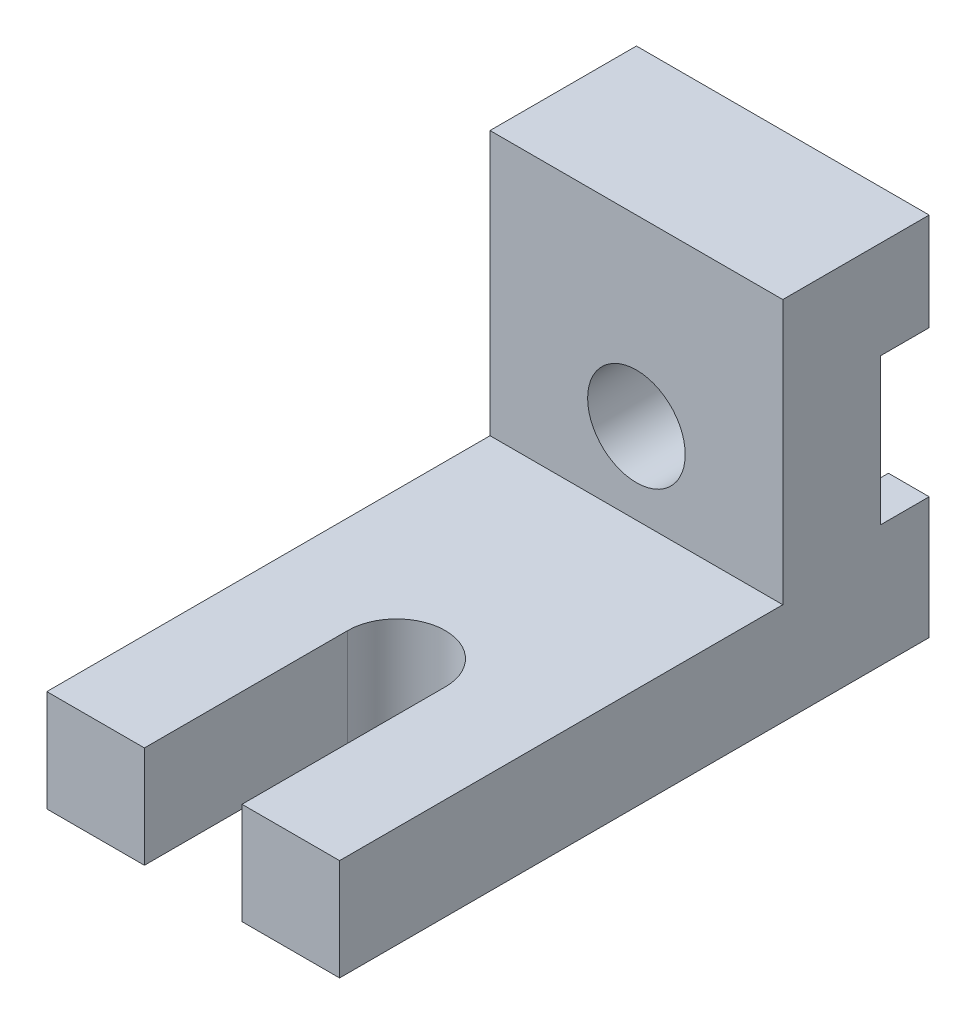
ISO-10303-21;
HEADER;
FILE_DESCRIPTION(('STEP AP214'),'2;1');
FILE_NAME('part.step','',(''),(''),'','','');
FILE_SCHEMA(('AUTOMOTIVE_DESIGN { 1 0 10303 214 1 1 1 1 }'));
ENDSEC;
DATA;
#1=APPLICATION_CONTEXT('core data for automotive mechanical design processes');
#2=APPLICATION_PROTOCOL_DEFINITION('international standard','automotive_design',2000,#1);
#3=PRODUCT_CONTEXT('',#1,'mechanical');
#4=PRODUCT('Part','Part','',(#3));
#5=PRODUCT_RELATED_PRODUCT_CATEGORY('part','',(#4));
#6=PRODUCT_DEFINITION_FORMATION('','',#4);
#7=PRODUCT_DEFINITION_CONTEXT('part definition',#1,'design');
#8=PRODUCT_DEFINITION('design','',#6,#7);
#9=PRODUCT_DEFINITION_SHAPE('','',#8);
#10=(LENGTH_UNIT() NAMED_UNIT(*) SI_UNIT(.MILLI.,.METRE.));
#11=(NAMED_UNIT(*) PLANE_ANGLE_UNIT() SI_UNIT($,.RADIAN.));
#12=(NAMED_UNIT(*) SI_UNIT($,.STERADIAN.) SOLID_ANGLE_UNIT());
#13=UNCERTAINTY_MEASURE_WITH_UNIT(LENGTH_MEASURE(1.E-05),#10,'distance_accuracy_value','');
#14=(GEOMETRIC_REPRESENTATION_CONTEXT(3) GLOBAL_UNCERTAINTY_ASSIGNED_CONTEXT((#13)) GLOBAL_UNIT_ASSIGNED_CONTEXT((#10,
#11,#12)) REPRESENTATION_CONTEXT('',''));
#15=CARTESIAN_POINT('',(0.,0.,0.));
#16=DIRECTION('',(0.,0.,1.));
#17=DIRECTION('',(1.,0.,0.));
#18=AXIS2_PLACEMENT_3D('',#15,#16,#17);
#19=CARTESIAN_POINT('',(0.,0.,0.));
#20=DIRECTION('',(0.,0.,1.));
#21=DIRECTION('',(1.,0.,0.));
#22=AXIS2_PLACEMENT_3D('',#19,#20,#21);
#23=PLANE('',#22);
#24=DIRECTION('',(0.,1.,0.));
#25=VECTOR('',#24,1.);
#26=CARTESIAN_POINT('',(914.399999999999,-1143.,0.));
#27=LINE('',#26,#25);
#28=CARTESIAN_POINT('',(914.399999999999,533.400000000001,0.));
#29=VERTEX_POINT('',#28);
#30=CARTESIAN_POINT('',(914.399999999999,1143.,0.));
#31=VERTEX_POINT('',#30);
#32=EDGE_CURVE('E337',#29,#31,#27,.T.);
#33=ORIENTED_EDGE('',*,*,#32,.F.);
#34=DIRECTION('',(1.,0.,0.));
#35=VECTOR('',#34,1.);
#36=CARTESIAN_POINT('',(914.399999999999,533.400000000001,0.));
#37=LINE('',#36,#35);
#38=CARTESIAN_POINT('',(544.176846254964,533.400000000001,0.));
#39=VERTEX_POINT('',#38);
#40=EDGE_CURVE('E204',#39,#29,#37,.T.);
#41=ORIENTED_EDGE('',*,*,#40,.F.);
#42=CARTESIAN_POINT('',(0.,0.,0.));
#43=DIRECTION('',(0.,0.,-1.));
#44=DIRECTION('',(-1.,0.,0.));
#45=AXIS2_PLACEMENT_3D('',#42,#43,#44);
#46=CIRCLE('',#45,762.);
#47=CARTESIAN_POINT('',(-544.176846254964,533.400000000001,0.));
#48=VERTEX_POINT('',#47);
#49=EDGE_CURVE('E381',#48,#39,#46,.T.);
#50=ORIENTED_EDGE('',*,*,#49,.F.);
#51=DIRECTION('',(1.,0.,0.));
#52=VECTOR('',#51,1.);
#53=CARTESIAN_POINT('',(-544.176846254964,533.400000000001,0.));
#54=LINE('',#53,#52);
#55=CARTESIAN_POINT('',(-914.400000000001,533.400000000001,0.));
#56=VERTEX_POINT('',#55);
#57=EDGE_CURVE('E377',#56,#48,#54,.T.);
#58=ORIENTED_EDGE('',*,*,#57,.F.);
#59=DIRECTION('',(0.,-1.,0.));
#60=VECTOR('',#59,1.);
#61=CARTESIAN_POINT('',(-914.400000000001,-1143.,0.));
#62=LINE('',#61,#60);
#63=CARTESIAN_POINT('',(-914.400000000001,1143.,0.));
#64=VERTEX_POINT('',#63);
#65=EDGE_CURVE('E330',#64,#56,#62,.T.);
#66=ORIENTED_EDGE('',*,*,#65,.F.);
#67=DIRECTION('',(-1.,0.,0.));
#68=VECTOR('',#67,1.);
#69=CARTESIAN_POINT('',(914.399999999999,1143.,0.));
#70=LINE('',#69,#68);
#71=EDGE_CURVE('E323',#31,#64,#70,.T.);
#72=ORIENTED_EDGE('',*,*,#71,.F.);
#73=EDGE_LOOP('',(#33,#41,#50,#58,#66,#72));
#74=FACE_BOUND('',#73,.T.);
#75=ADVANCED_FACE('F39',(#74),#23,.F.);
#76=CARTESIAN_POINT('',(0.,0.,3683.));
#77=DIRECTION('',(0.,0.,-1.));
#78=DIRECTION('',(-1.,0.,0.));
#79=AXIS2_PLACEMENT_3D('',#76,#77,#78);
#80=PLANE('',#79);
#81=DIRECTION('',(1.,0.,0.));
#82=VECTOR('',#81,1.);
#83=CARTESIAN_POINT('',(-914.400000000001,-1143.,3683.));
#84=LINE('',#83,#82);
#85=CARTESIAN_POINT('',(-914.400000000001,-1143.,3683.));
#86=VERTEX_POINT('',#85);
#87=CARTESIAN_POINT('',(-304.800000000001,-1143.,3683.));
#88=VERTEX_POINT('',#87);
#89=EDGE_CURVE('E296',#86,#88,#84,.T.);
#90=ORIENTED_EDGE('',*,*,#89,.T.);
#91=DIRECTION('',(0.,1.,0.));
#92=VECTOR('',#91,1.);
#93=CARTESIAN_POINT('',(-304.800000000001,-1143.,3683.));
#94=LINE('',#93,#92);
#95=CARTESIAN_POINT('',(-304.800000000001,-508.,3683.));
#96=VERTEX_POINT('',#95);
#97=EDGE_CURVE('E278',#88,#96,#94,.T.);
#98=ORIENTED_EDGE('',*,*,#97,.T.);
#99=DIRECTION('',(-1.,0.,0.));
#100=VECTOR('',#99,1.);
#101=CARTESIAN_POINT('',(-914.400000000001,-508.,3683.));
#102=LINE('',#101,#100);
#103=CARTESIAN_POINT('',(-914.400000000001,-508.,3683.));
#104=VERTEX_POINT('',#103);
#105=EDGE_CURVE('E303',#96,#104,#102,.T.);
#106=ORIENTED_EDGE('',*,*,#105,.T.);
#107=DIRECTION('',(0.,-1.,0.));
#108=VECTOR('',#107,1.);
#109=CARTESIAN_POINT('',(-914.400000000001,-1143.,3683.));
#110=LINE('',#109,#108);
#111=EDGE_CURVE('E291',#104,#86,#110,.T.);
#112=ORIENTED_EDGE('',*,*,#111,.T.);
#113=EDGE_LOOP('',(#90,#98,#106,#112));
#114=FACE_BOUND('',#113,.T.);
#115=ADVANCED_FACE('F429',(#114),#80,.F.);
#116=CARTESIAN_POINT('',(-914.400000000001,-1143.,914.4));
#117=DIRECTION('',(1.,0.,0.));
#118=DIRECTION('',(0.,0.,-1.));
#119=AXIS2_PLACEMENT_3D('',#116,#117,#118);
#120=PLANE('',#119);
#121=ORIENTED_EDGE('',*,*,#65,.T.);
#122=DIRECTION('',(0.,0.,-1.));
#123=VECTOR('',#122,1.);
#124=CARTESIAN_POINT('',(-914.400000000001,533.400000000001,304.8));
#125=LINE('',#124,#123);
#126=CARTESIAN_POINT('',(-914.400000000001,533.400000000001,304.8));
#127=VERTEX_POINT('',#126);
#128=EDGE_CURVE('E395',#127,#56,#125,.T.);
#129=ORIENTED_EDGE('',*,*,#128,.F.);
#130=DIRECTION('',(0.,1.,0.));
#131=VECTOR('',#130,1.);
#132=CARTESIAN_POINT('',(-914.400000000001,533.400000000001,304.8));
#133=LINE('',#132,#131);
#134=CARTESIAN_POINT('',(-914.400000000001,-380.999999999999,304.8));
#135=VERTEX_POINT('',#134);
#136=EDGE_CURVE('E618',#135,#127,#133,.T.);
#137=ORIENTED_EDGE('',*,*,#136,.F.);
#138=DIRECTION('',(0.,0.,-1.));
#139=VECTOR('',#138,1.);
#140=CARTESIAN_POINT('',(-914.400000000001,-380.999999999999,304.8));
#141=LINE('',#140,#139);
#142=CARTESIAN_POINT('',(-914.400000000001,-380.999999999999,0.));
#143=VERTEX_POINT('',#142);
#144=EDGE_CURVE('E398',#135,#143,#141,.T.);
#145=ORIENTED_EDGE('',*,*,#144,.T.);
#146=CARTESIAN_POINT('',(-914.400000000001,-990.599999999999,0.));
#147=VERTEX_POINT('',#146);
#148=EDGE_CURVE('E63',#143,#147,#62,.T.);
#149=ORIENTED_EDGE('',*,*,#148,.T.);
#150=DIRECTION('',(0.,0.,-1.));
#151=VECTOR('',#150,1.);
#152=CARTESIAN_POINT('',(-914.400000000001,-990.6,0.));
#153=LINE('',#152,#151);
#154=CARTESIAN_POINT('',(-914.400000000001,-990.6,1828.8));
#155=VERTEX_POINT('',#154);
#156=EDGE_CURVE('E221',#155,#147,#153,.T.);
#157=ORIENTED_EDGE('',*,*,#156,.F.);
#158=DIRECTION('',(0.,-1.,0.));
#159=VECTOR('',#158,1.);
#160=CARTESIAN_POINT('',(-914.400000000001,-990.6,1828.8));
#161=LINE('',#160,#159);
#162=CARTESIAN_POINT('',(-914.400000000001,-1143.,1828.8));
#163=VERTEX_POINT('',#162);
#164=EDGE_CURVE('E245',#155,#163,#161,.T.);
#165=ORIENTED_EDGE('',*,*,#164,.T.);
#166=DIRECTION('',(0.,0.,-1.));
#167=VECTOR('',#166,1.);
#168=CARTESIAN_POINT('',(-914.400000000001,-1143.,914.4));
#169=LINE('',#168,#167);
#170=EDGE_CURVE('E11',#86,#163,#169,.T.);
#171=ORIENTED_EDGE('',*,*,#170,.F.);
#172=ORIENTED_EDGE('',*,*,#111,.F.);
#173=DIRECTION('',(0.,0.,-1.));
#174=VECTOR('',#173,1.);
#175=CARTESIAN_POINT('',(-914.400000000001,-508.,3683.));
#176=LINE('',#175,#174);
#177=CARTESIAN_POINT('',(-914.400000000001,-508.,914.4));
#178=VERTEX_POINT('',#177);
#179=EDGE_CURVE('E308',#104,#178,#176,.T.);
#180=ORIENTED_EDGE('',*,*,#179,.T.);
#181=DIRECTION('',(0.,-1.,0.));
#182=VECTOR('',#181,1.);
#183=CARTESIAN_POINT('',(-914.400000000001,-1143.,914.4));
#184=LINE('',#183,#182);
#185=CARTESIAN_POINT('',(-914.400000000001,1143.,914.4));
#186=VERTEX_POINT('',#185);
#187=EDGE_CURVE('E319',#186,#178,#184,.T.);
#188=ORIENTED_EDGE('',*,*,#187,.F.);
#189=DIRECTION('',(0.,0.,-1.));
#190=VECTOR('',#189,1.);
#191=CARTESIAN_POINT('',(-914.400000000001,1143.,914.4));
#192=LINE('',#191,#190);
#193=EDGE_CURVE('E329',#186,#64,#192,.T.);
#194=ORIENTED_EDGE('',*,*,#193,.T.);
#195=EDGE_LOOP('',(#121,#129,#137,#145,#149,#157,#165,#171,#172,#180,#188,#194));
#196=FACE_BOUND('',#195,.T.);
#197=ADVANCED_FACE('F41',(#196),#120,.F.);
#198=CARTESIAN_POINT('',(914.399999999999,-1143.,914.4));
#199=DIRECTION('',(0.,1.,0.));
#200=DIRECTION('',(-1.,0.,0.));
#201=AXIS2_PLACEMENT_3D('',#198,#199,#200);
#202=PLANE('',#201);
#203=ORIENTED_EDGE('',*,*,#170,.T.);
#204=DIRECTION('',(-1.,0.,0.));
#205=VECTOR('',#204,1.);
#206=CARTESIAN_POINT('',(-914.400000000001,-1143.,1828.8));
#207=LINE('',#206,#205);
#208=CARTESIAN_POINT('',(355.599999999999,-1143.,1828.8));
#209=VERTEX_POINT('',#208);
#210=EDGE_CURVE('E225',#209,#163,#207,.T.);
#211=ORIENTED_EDGE('',*,*,#210,.F.);
#212=DIRECTION('',(0.,0.,1.));
#213=VECTOR('',#212,1.);
#214=CARTESIAN_POINT('',(355.599999999999,-1143.,0.));
#215=LINE('',#214,#213);
#216=CARTESIAN_POINT('',(355.599999999999,-1143.,0.));
#217=VERTEX_POINT('',#216);
#218=EDGE_CURVE('E238',#217,#209,#215,.T.);
#219=ORIENTED_EDGE('',*,*,#218,.F.);
#220=DIRECTION('',(1.,0.,0.));
#221=VECTOR('',#220,1.);
#222=CARTESIAN_POINT('',(914.399999999999,-1143.,0.));
#223=LINE('',#222,#221);
#224=CARTESIAN_POINT('',(914.399999999999,-1143.,0.));
#225=VERTEX_POINT('',#224);
#226=EDGE_CURVE('E334',#217,#225,#223,.T.);
#227=ORIENTED_EDGE('',*,*,#226,.T.);
#228=DIRECTION('',(0.,0.,-1.));
#229=VECTOR('',#228,1.);
#230=CARTESIAN_POINT('',(914.399999999999,-1143.,914.4));
#231=LINE('',#230,#229);
#232=CARTESIAN_POINT('',(914.399999999999,-1143.,3683.));
#233=VERTEX_POINT('',#232);
#234=EDGE_CURVE('E48',#233,#225,#231,.T.);
#235=ORIENTED_EDGE('',*,*,#234,.F.);
#236=CARTESIAN_POINT('',(304.8,-1143.,3683.));
#237=VERTEX_POINT('',#236);
#238=EDGE_CURVE('E295',#237,#233,#84,.T.);
#239=ORIENTED_EDGE('',*,*,#238,.F.);
#240=DIRECTION('',(0.,0.,-1.));
#241=VECTOR('',#240,1.);
#242=CARTESIAN_POINT('',(304.799999999999,-1143.,3683.));
#243=LINE('',#242,#241);
#244=CARTESIAN_POINT('',(304.799999999999,-1143.,2413.));
#245=VERTEX_POINT('',#244);
#246=EDGE_CURVE('E255',#237,#245,#243,.T.);
#247=ORIENTED_EDGE('',*,*,#246,.T.);
#248=CARTESIAN_POINT('',(0.,-1143.,2413.));
#249=DIRECTION('',(0.,1.,0.));
#250=DIRECTION('',(0.,0.,1.));
#251=AXIS2_PLACEMENT_3D('',#248,#249,#250);
#252=CIRCLE('',#251,304.8);
#253=CARTESIAN_POINT('',(-304.8,-1143.,2413.));
#254=VERTEX_POINT('',#253);
#255=EDGE_CURVE('E259',#245,#254,#252,.T.);
#256=ORIENTED_EDGE('',*,*,#255,.T.);
#257=DIRECTION('',(0.,0.,1.));
#258=VECTOR('',#257,1.);
#259=CARTESIAN_POINT('',(-304.800000000001,-1143.,3683.));
#260=LINE('',#259,#258);
#261=EDGE_CURVE('E264',#254,#88,#260,.T.);
#262=ORIENTED_EDGE('',*,*,#261,.T.);
#263=ORIENTED_EDGE('',*,*,#89,.F.);
#264=EDGE_LOOP('',(#203,#211,#219,#227,#235,#239,#247,#256,#262,#263));
#265=FACE_BOUND('',#264,.T.);
#266=ADVANCED_FACE('F415',(#265),#202,.F.);
#267=CARTESIAN_POINT('',(914.399999999999,-1143.,914.4));
#268=DIRECTION('',(-1.,0.,0.));
#269=DIRECTION('',(0.,-1.,0.));
#270=AXIS2_PLACEMENT_3D('',#267,#268,#269);
#271=PLANE('',#270);
#272=DIRECTION('',(0.,-1.,0.));
#273=VECTOR('',#272,1.);
#274=CARTESIAN_POINT('',(914.399999999999,533.400000000001,304.8));
#275=LINE('',#274,#273);
#276=CARTESIAN_POINT('',(914.399999999999,533.400000000001,304.8));
#277=VERTEX_POINT('',#276);
#278=CARTESIAN_POINT('',(914.399999999999,-380.999999999999,304.8));
#279=VERTEX_POINT('',#278);
#280=EDGE_CURVE('E193',#277,#279,#275,.T.);
#281=ORIENTED_EDGE('',*,*,#280,.F.);
#282=DIRECTION('',(0.,0.,-1.));
#283=VECTOR('',#282,1.);
#284=CARTESIAN_POINT('',(914.399999999999,533.400000000001,304.8));
#285=LINE('',#284,#283);
#286=EDGE_CURVE('E242',#277,#29,#285,.T.);
#287=ORIENTED_EDGE('',*,*,#286,.T.);
#288=ORIENTED_EDGE('',*,*,#32,.T.);
#289=DIRECTION('',(0.,0.,-1.));
#290=VECTOR('',#289,1.);
#291=CARTESIAN_POINT('',(914.399999999999,1143.,914.4));
#292=LINE('',#291,#290);
#293=CARTESIAN_POINT('',(914.399999999999,1143.,914.4));
#294=VERTEX_POINT('',#293);
#295=EDGE_CURVE('E345',#294,#31,#292,.T.);
#296=ORIENTED_EDGE('',*,*,#295,.F.);
#297=DIRECTION('',(0.,1.,0.));
#298=VECTOR('',#297,1.);
#299=CARTESIAN_POINT('',(914.399999999999,-1143.,914.4));
#300=LINE('',#299,#298);
#301=CARTESIAN_POINT('',(914.399999999999,-508.,914.4));
#302=VERTEX_POINT('',#301);
#303=EDGE_CURVE('E322',#302,#294,#300,.T.);
#304=ORIENTED_EDGE('',*,*,#303,.F.);
#305=DIRECTION('',(0.,0.,-1.));
#306=VECTOR('',#305,1.);
#307=CARTESIAN_POINT('',(914.399999999999,-508.,3683.));
#308=LINE('',#307,#306);
#309=CARTESIAN_POINT('',(914.399999999999,-508.,3683.));
#310=VERTEX_POINT('',#309);
#311=EDGE_CURVE('E315',#310,#302,#308,.T.);
#312=ORIENTED_EDGE('',*,*,#311,.F.);
#313=DIRECTION('',(0.,1.,0.));
#314=VECTOR('',#313,1.);
#315=CARTESIAN_POINT('',(914.399999999999,-1143.,3683.));
#316=LINE('',#315,#314);
#317=EDGE_CURVE('E300',#233,#310,#316,.T.);
#318=ORIENTED_EDGE('',*,*,#317,.F.);
#319=ORIENTED_EDGE('',*,*,#234,.T.);
#320=CARTESIAN_POINT('',(914.399999999999,-380.999999999999,0.));
#321=VERTEX_POINT('',#320);
#322=EDGE_CURVE('E210',#225,#321,#27,.T.);
#323=ORIENTED_EDGE('',*,*,#322,.T.);
#324=DIRECTION('',(0.,0.,-1.));
#325=VECTOR('',#324,1.);
#326=CARTESIAN_POINT('',(914.399999999999,-380.999999999999,304.8));
#327=LINE('',#326,#325);
#328=EDGE_CURVE('E55',#279,#321,#327,.T.);
#329=ORIENTED_EDGE('',*,*,#328,.F.);
#330=EDGE_LOOP('',(#281,#287,#288,#296,#304,#312,#318,#319,#323,#329));
#331=FACE_BOUND('',#330,.T.);
#332=ADVANCED_FACE('F207',(#331),#271,.F.);
#333=CARTESIAN_POINT('',(914.399999999999,1143.,914.4));
#334=DIRECTION('',(0.,-1.,0.));
#335=DIRECTION('',(1.,0.,0.));
#336=AXIS2_PLACEMENT_3D('',#333,#334,#335);
#337=PLANE('',#336);
#338=ORIENTED_EDGE('',*,*,#71,.T.);
#339=ORIENTED_EDGE('',*,*,#193,.F.);
#340=DIRECTION('',(-1.,0.,0.));
#341=VECTOR('',#340,1.);
#342=CARTESIAN_POINT('',(914.399999999999,1143.,914.4));
#343=LINE('',#342,#341);
#344=EDGE_CURVE('E326',#294,#186,#343,.T.);
#345=ORIENTED_EDGE('',*,*,#344,.F.);
#346=ORIENTED_EDGE('',*,*,#295,.T.);
#347=EDGE_LOOP('',(#338,#339,#345,#346));
#348=FACE_BOUND('',#347,.T.);
#349=ADVANCED_FACE('F475',(#348),#337,.F.);
#350=CARTESIAN_POINT('',(0.,0.,914.4));
#351=DIRECTION('',(0.,0.,1.));
#352=DIRECTION('',(1.,0.,0.));
#353=AXIS2_PLACEMENT_3D('',#350,#351,#352);
#354=PLANE('',#353);
#355=CARTESIAN_POINT('',(0.,0.,914.4));
#356=DIRECTION('',(0.,0.,1.));
#357=DIRECTION('',(1.,0.,0.));
#358=AXIS2_PLACEMENT_3D('',#355,#356,#357);
#359=CIRCLE('',#358,304.8);
#360=CARTESIAN_POINT('',(304.8,0.,914.4));
#361=VERTEX_POINT('',#360);
#362=EDGE_CURVE('E364',#361,#361,#359,.T.);
#363=ORIENTED_EDGE('',*,*,#362,.F.);
#364=EDGE_LOOP('',(#363));
#365=FACE_BOUND('',#364,.T.);
#366=DIRECTION('',(-1.,0.,0.));
#367=VECTOR('',#366,1.);
#368=CARTESIAN_POINT('',(-914.400000000001,-508.,914.4));
#369=LINE('',#368,#367);
#370=EDGE_CURVE('E282',#302,#178,#369,.T.);
#371=ORIENTED_EDGE('',*,*,#370,.F.);
#372=ORIENTED_EDGE('',*,*,#303,.T.);
#373=ORIENTED_EDGE('',*,*,#344,.T.);
#374=ORIENTED_EDGE('',*,*,#187,.T.);
#375=EDGE_LOOP('',(#371,#372,#373,#374));
#376=FACE_BOUND('',#375,.T.);
#377=ADVANCED_FACE('F468',(#365,#376),#354,.T.);
#378=ORIENTED_EDGE('',*,*,#148,.F.);
#379=DIRECTION('',(-1.,0.,0.));
#380=VECTOR('',#379,1.);
#381=CARTESIAN_POINT('',(-659.911357683743,-380.999999999999,0.));
#382=LINE('',#381,#380);
#383=CARTESIAN_POINT('',(-659.911357683743,-380.999999999999,0.));
#384=VERTEX_POINT('',#383);
#385=EDGE_CURVE('E368',#384,#143,#382,.T.);
#386=ORIENTED_EDGE('',*,*,#385,.F.);
#387=CARTESIAN_POINT('',(0.,0.,0.));
#388=DIRECTION('',(0.,0.,-1.));
#389=DIRECTION('',(-1.,0.,0.));
#390=AXIS2_PLACEMENT_3D('',#387,#388,#389);
#391=CIRCLE('',#390,762.);
#392=CARTESIAN_POINT('',(659.911357683743,-380.999999999999,0.));
#393=VERTEX_POINT('',#392);
#394=EDGE_CURVE('E362',#393,#384,#391,.T.);
#395=ORIENTED_EDGE('',*,*,#394,.F.);
#396=DIRECTION('',(-1.,0.,0.));
#397=VECTOR('',#396,1.);
#398=CARTESIAN_POINT('',(914.399999999999,-380.999999999999,0.));
#399=LINE('',#398,#397);
#400=EDGE_CURVE('E359',#321,#393,#399,.T.);
#401=ORIENTED_EDGE('',*,*,#400,.F.);
#402=ORIENTED_EDGE('',*,*,#322,.F.);
#403=ORIENTED_EDGE('',*,*,#226,.F.);
#404=DIRECTION('',(0.,-1.,0.));
#405=VECTOR('',#404,1.);
#406=CARTESIAN_POINT('',(355.599999999999,-990.599999999999,0.));
#407=LINE('',#406,#405);
#408=CARTESIAN_POINT('',(355.599999999999,-990.599999999999,0.));
#409=VERTEX_POINT('',#408);
#410=EDGE_CURVE('E237',#409,#217,#407,.T.);
#411=ORIENTED_EDGE('',*,*,#410,.F.);
#412=DIRECTION('',(1.,0.,0.));
#413=VECTOR('',#412,1.);
#414=CARTESIAN_POINT('',(-914.400000000001,-990.6,0.));
#415=LINE('',#414,#413);
#416=EDGE_CURVE('E224',#147,#409,#415,.T.);
#417=ORIENTED_EDGE('',*,*,#416,.F.);
#418=EDGE_LOOP('',(#378,#386,#395,#401,#402,#403,#411,#417));
#419=FACE_BOUND('',#418,.T.);
#420=ADVANCED_FACE('F356',(#419),#23,.F.);
#421=CARTESIAN_POINT('',(-914.400000000001,-508.,3683.));
#422=DIRECTION('',(0.,-1.,0.));
#423=DIRECTION('',(0.,0.,-1.));
#424=AXIS2_PLACEMENT_3D('',#421,#422,#423);
#425=PLANE('',#424);
#426=ORIENTED_EDGE('',*,*,#105,.F.);
#427=DIRECTION('',(0.,0.,1.));
#428=VECTOR('',#427,1.);
#429=CARTESIAN_POINT('',(-304.800000000001,-508.,3683.));
#430=LINE('',#429,#428);
#431=CARTESIAN_POINT('',(-304.8,-508.,2413.));
#432=VERTEX_POINT('',#431);
#433=EDGE_CURVE('E260',#432,#96,#430,.T.);
#434=ORIENTED_EDGE('',*,*,#433,.F.);
#435=CARTESIAN_POINT('',(0.,-508.,2413.));
#436=DIRECTION('',(0.,1.,0.));
#437=DIRECTION('',(0.,0.,1.));
#438=AXIS2_PLACEMENT_3D('',#435,#436,#437);
#439=CIRCLE('',#438,304.8);
#440=CARTESIAN_POINT('',(304.799999999999,-508.,2413.));
#441=VERTEX_POINT('',#440);
#442=EDGE_CURVE('E272',#441,#432,#439,.T.);
#443=ORIENTED_EDGE('',*,*,#442,.F.);
#444=DIRECTION('',(0.,0.,-1.));
#445=VECTOR('',#444,1.);
#446=CARTESIAN_POINT('',(304.799999999999,-508.,3683.));
#447=LINE('',#446,#445);
#448=CARTESIAN_POINT('',(304.799999999999,-508.,3683.));
#449=VERTEX_POINT('',#448);
#450=EDGE_CURVE('E249',#449,#441,#447,.T.);
#451=ORIENTED_EDGE('',*,*,#450,.F.);
#452=EDGE_CURVE('E304',#310,#449,#102,.T.);
#453=ORIENTED_EDGE('',*,*,#452,.F.);
#454=ORIENTED_EDGE('',*,*,#311,.T.);
#455=ORIENTED_EDGE('',*,*,#370,.T.);
#456=ORIENTED_EDGE('',*,*,#179,.F.);
#457=EDGE_LOOP('',(#426,#434,#443,#451,#453,#454,#455,#456));
#458=FACE_BOUND('',#457,.T.);
#459=ADVANCED_FACE('F467',(#458),#425,.F.);
#460=ORIENTED_EDGE('',*,*,#452,.T.);
#461=DIRECTION('',(0.,1.,0.));
#462=VECTOR('',#461,1.);
#463=CARTESIAN_POINT('',(304.799999999999,-1143.,3683.));
#464=LINE('',#463,#462);
#465=EDGE_CURVE('E268',#237,#449,#464,.T.);
#466=ORIENTED_EDGE('',*,*,#465,.F.);
#467=ORIENTED_EDGE('',*,*,#238,.T.);
#468=ORIENTED_EDGE('',*,*,#317,.T.);
#469=EDGE_LOOP('',(#460,#466,#467,#468));
#470=FACE_BOUND('',#469,.T.);
#471=ADVANCED_FACE('F414',(#470),#80,.F.);
#472=CARTESIAN_POINT('',(-304.800000000001,-1143.,3683.));
#473=DIRECTION('',(-1.,0.,0.));
#474=DIRECTION('',(0.,0.,1.));
#475=AXIS2_PLACEMENT_3D('',#472,#473,#474);
#476=PLANE('',#475);
#477=ORIENTED_EDGE('',*,*,#433,.T.);
#478=ORIENTED_EDGE('',*,*,#97,.F.);
#479=ORIENTED_EDGE('',*,*,#261,.F.);
#480=DIRECTION('',(0.,1.,0.));
#481=VECTOR('',#480,1.);
#482=CARTESIAN_POINT('',(-304.8,-1143.,2413.));
#483=LINE('',#482,#481);
#484=EDGE_CURVE('E283',#254,#432,#483,.T.);
#485=ORIENTED_EDGE('',*,*,#484,.T.);
#486=EDGE_LOOP('',(#477,#478,#479,#485));
#487=FACE_BOUND('',#486,.T.);
#488=ADVANCED_FACE('F426',(#487),#476,.F.);
#489=CARTESIAN_POINT('',(0.,-1143.,2413.));
#490=DIRECTION('',(0.,1.,0.));
#491=DIRECTION('',(0.,0.,1.));
#492=AXIS2_PLACEMENT_3D('',#489,#490,#491);
#493=CYLINDRICAL_SURFACE('',#492,304.8);
#494=ORIENTED_EDGE('',*,*,#442,.T.);
#495=ORIENTED_EDGE('',*,*,#484,.F.);
#496=ORIENTED_EDGE('',*,*,#255,.F.);
#497=DIRECTION('',(0.,1.,0.));
#498=VECTOR('',#497,1.);
#499=CARTESIAN_POINT('',(304.799999999999,-1143.,2413.));
#500=LINE('',#499,#498);
#501=EDGE_CURVE('E286',#245,#441,#500,.T.);
#502=ORIENTED_EDGE('',*,*,#501,.T.);
#503=EDGE_LOOP('',(#494,#495,#496,#502));
#504=FACE_BOUND('',#503,.T.);
#505=ADVANCED_FACE('F422',(#504),#493,.F.);
#506=CARTESIAN_POINT('',(304.799999999999,-1143.,3683.));
#507=DIRECTION('',(1.,0.,0.));
#508=DIRECTION('',(0.,0.,-1.));
#509=AXIS2_PLACEMENT_3D('',#506,#507,#508);
#510=PLANE('',#509);
#511=ORIENTED_EDGE('',*,*,#450,.T.);
#512=ORIENTED_EDGE('',*,*,#501,.F.);
#513=ORIENTED_EDGE('',*,*,#246,.F.);
#514=ORIENTED_EDGE('',*,*,#465,.T.);
#515=EDGE_LOOP('',(#511,#512,#513,#514));
#516=FACE_BOUND('',#515,.T.);
#517=ADVANCED_FACE('F418',(#516),#510,.F.);
#518=CARTESIAN_POINT('',(-914.400000000001,-990.6,1828.8));
#519=DIRECTION('',(0.,0.,1.));
#520=DIRECTION('',(1.,0.,0.));
#521=AXIS2_PLACEMENT_3D('',#518,#519,#520);
#522=PLANE('',#521);
#523=ORIENTED_EDGE('',*,*,#210,.T.);
#524=ORIENTED_EDGE('',*,*,#164,.F.);
#525=DIRECTION('',(-1.,0.,0.));
#526=VECTOR('',#525,1.);
#527=CARTESIAN_POINT('',(-914.400000000001,-990.6,1828.8));
#528=LINE('',#527,#526);
#529=CARTESIAN_POINT('',(355.599999999999,-990.599999999999,1828.8));
#530=VERTEX_POINT('',#529);
#531=EDGE_CURVE('E233',#530,#155,#528,.T.);
#532=ORIENTED_EDGE('',*,*,#531,.F.);
#533=DIRECTION('',(0.,-1.,0.));
#534=VECTOR('',#533,1.);
#535=CARTESIAN_POINT('',(355.599999999999,-990.599999999999,1828.8));
#536=LINE('',#535,#534);
#537=EDGE_CURVE('E250',#530,#209,#536,.T.);
#538=ORIENTED_EDGE('',*,*,#537,.T.);
#539=EDGE_LOOP('',(#523,#524,#532,#538));
#540=FACE_BOUND('',#539,.T.);
#541=ADVANCED_FACE('F437',(#540),#522,.F.);
#542=CARTESIAN_POINT('',(355.599999999999,-990.599999999999,0.));
#543=DIRECTION('',(1.,0.,0.));
#544=DIRECTION('',(0.,1.,0.));
#545=AXIS2_PLACEMENT_3D('',#542,#543,#544);
#546=PLANE('',#545);
#547=ORIENTED_EDGE('',*,*,#218,.T.);
#548=ORIENTED_EDGE('',*,*,#537,.F.);
#549=DIRECTION('',(0.,0.,1.));
#550=VECTOR('',#549,1.);
#551=CARTESIAN_POINT('',(355.599999999999,-990.599999999999,0.));
#552=LINE('',#551,#550);
#553=EDGE_CURVE('E229',#409,#530,#552,.T.);
#554=ORIENTED_EDGE('',*,*,#553,.F.);
#555=ORIENTED_EDGE('',*,*,#410,.T.);
#556=EDGE_LOOP('',(#547,#548,#554,#555));
#557=FACE_BOUND('',#556,.T.);
#558=ADVANCED_FACE('F440',(#557),#546,.F.);
#559=CARTESIAN_POINT('',(1.81336427355442E-13,-990.599999999999,0.));
#560=DIRECTION('',(0.,1.,0.));
#561=DIRECTION('',(-1.,0.,0.));
#562=AXIS2_PLACEMENT_3D('',#559,#560,#561);
#563=PLANE('',#562);
#564=ORIENTED_EDGE('',*,*,#156,.T.);
#565=ORIENTED_EDGE('',*,*,#416,.T.);
#566=ORIENTED_EDGE('',*,*,#553,.T.);
#567=ORIENTED_EDGE('',*,*,#531,.T.);
#568=EDGE_LOOP('',(#564,#565,#566,#567));
#569=FACE_BOUND('',#568,.T.);
#570=ADVANCED_FACE('F442',(#569),#563,.F.);
#571=CARTESIAN_POINT('',(914.399999999999,533.400000000001,304.8));
#572=DIRECTION('',(0.,1.,0.));
#573=DIRECTION('',(0.,0.,1.));
#574=AXIS2_PLACEMENT_3D('',#571,#572,#573);
#575=PLANE('',#574);
#576=ORIENTED_EDGE('',*,*,#40,.T.);
#577=ORIENTED_EDGE('',*,*,#286,.F.);
#578=DIRECTION('',(1.,0.,0.));
#579=VECTOR('',#578,1.);
#580=CARTESIAN_POINT('',(914.399999999999,533.400000000001,304.8));
#581=LINE('',#580,#579);
#582=CARTESIAN_POINT('',(544.176846254964,533.400000000001,304.8));
#583=VERTEX_POINT('',#582);
#584=EDGE_CURVE('E200',#583,#277,#581,.T.);
#585=ORIENTED_EDGE('',*,*,#584,.F.);
#586=DIRECTION('',(0.,0.,-1.));
#587=VECTOR('',#586,1.);
#588=CARTESIAN_POINT('',(544.176846254964,533.400000000001,304.8));
#589=LINE('',#588,#587);
#590=EDGE_CURVE('E389',#583,#39,#589,.T.);
#591=ORIENTED_EDGE('',*,*,#590,.T.);
#592=EDGE_LOOP('',(#576,#577,#585,#591));
#593=FACE_BOUND('',#592,.T.);
#594=ADVANCED_FACE('F444',(#593),#575,.F.);
#595=CARTESIAN_POINT('',(0.,0.,304.8));
#596=DIRECTION('',(0.,0.,-1.));
#597=DIRECTION('',(-1.,0.,0.));
#598=AXIS2_PLACEMENT_3D('',#595,#596,#597);
#599=CYLINDRICAL_SURFACE('',#598,762.);
#600=ORIENTED_EDGE('',*,*,#49,.T.);
#601=ORIENTED_EDGE('',*,*,#590,.F.);
#602=CARTESIAN_POINT('',(0.,0.,304.8));
#603=DIRECTION('',(0.,0.,-1.));
#604=DIRECTION('',(-1.,0.,0.));
#605=AXIS2_PLACEMENT_3D('',#602,#603,#604);
#606=CIRCLE('',#605,762.);
#607=CARTESIAN_POINT('',(-544.176846254964,533.400000000001,304.8));
#608=VERTEX_POINT('',#607);
#609=EDGE_CURVE('E217',#608,#583,#606,.T.);
#610=ORIENTED_EDGE('',*,*,#609,.F.);
#611=DIRECTION('',(0.,0.,-1.));
#612=VECTOR('',#611,1.);
#613=CARTESIAN_POINT('',(-544.176846254964,533.400000000001,304.8));
#614=LINE('',#613,#612);
#615=EDGE_CURVE('E392',#608,#48,#614,.T.);
#616=ORIENTED_EDGE('',*,*,#615,.T.);
#617=EDGE_LOOP('',(#600,#601,#610,#616));
#618=FACE_BOUND('',#617,.T.);
#619=ADVANCED_FACE('F450',(#618),#599,.F.);
#620=CARTESIAN_POINT('',(-544.176846254964,533.400000000001,304.8));
#621=DIRECTION('',(0.,1.,0.));
#622=DIRECTION('',(-1.,0.,0.));
#623=AXIS2_PLACEMENT_3D('',#620,#621,#622);
#624=PLANE('',#623);
#625=ORIENTED_EDGE('',*,*,#57,.T.);
#626=ORIENTED_EDGE('',*,*,#615,.F.);
#627=DIRECTION('',(1.,0.,0.));
#628=VECTOR('',#627,1.);
#629=CARTESIAN_POINT('',(-544.176846254964,533.400000000001,304.8));
#630=LINE('',#629,#628);
#631=EDGE_CURVE('E622',#127,#608,#630,.T.);
#632=ORIENTED_EDGE('',*,*,#631,.F.);
#633=ORIENTED_EDGE('',*,*,#128,.T.);
#634=EDGE_LOOP('',(#625,#626,#632,#633));
#635=FACE_BOUND('',#634,.T.);
#636=ADVANCED_FACE('F548',(#635),#624,.F.);
#637=CARTESIAN_POINT('',(-659.911357683743,-380.999999999999,304.8));
#638=DIRECTION('',(0.,-1.,0.));
#639=DIRECTION('',(0.,0.,-1.));
#640=AXIS2_PLACEMENT_3D('',#637,#638,#639);
#641=PLANE('',#640);
#642=ORIENTED_EDGE('',*,*,#385,.T.);
#643=ORIENTED_EDGE('',*,*,#144,.F.);
#644=DIRECTION('',(-1.,0.,0.));
#645=VECTOR('',#644,1.);
#646=CARTESIAN_POINT('',(-659.911357683743,-380.999999999999,304.8));
#647=LINE('',#646,#645);
#648=CARTESIAN_POINT('',(-659.911357683743,-380.999999999999,304.8));
#649=VERTEX_POINT('',#648);
#650=EDGE_CURVE('E405',#649,#135,#647,.T.);
#651=ORIENTED_EDGE('',*,*,#650,.F.);
#652=DIRECTION('',(0.,0.,-1.));
#653=VECTOR('',#652,1.);
#654=CARTESIAN_POINT('',(-659.911357683743,-380.999999999999,304.8));
#655=LINE('',#654,#653);
#656=EDGE_CURVE('E215',#649,#384,#655,.T.);
#657=ORIENTED_EDGE('',*,*,#656,.T.);
#658=EDGE_LOOP('',(#642,#643,#651,#657));
#659=FACE_BOUND('',#658,.T.);
#660=ADVANCED_FACE('F403',(#659),#641,.F.);
#661=CARTESIAN_POINT('',(0.,0.,304.8));
#662=DIRECTION('',(0.,0.,-1.));
#663=DIRECTION('',(-1.,0.,0.));
#664=AXIS2_PLACEMENT_3D('',#661,#662,#663);
#665=CYLINDRICAL_SURFACE('',#664,762.);
#666=ORIENTED_EDGE('',*,*,#394,.T.);
#667=ORIENTED_EDGE('',*,*,#656,.F.);
#668=CARTESIAN_POINT('',(0.,0.,304.8));
#669=DIRECTION('',(0.,0.,-1.));
#670=DIRECTION('',(-1.,0.,0.));
#671=AXIS2_PLACEMENT_3D('',#668,#669,#670);
#672=CIRCLE('',#671,762.);
#673=CARTESIAN_POINT('',(659.911357683743,-380.999999999999,304.8));
#674=VERTEX_POINT('',#673);
#675=EDGE_CURVE('E192',#674,#649,#672,.T.);
#676=ORIENTED_EDGE('',*,*,#675,.F.);
#677=DIRECTION('',(0.,0.,-1.));
#678=VECTOR('',#677,1.);
#679=CARTESIAN_POINT('',(659.911357683743,-380.999999999999,304.8));
#680=LINE('',#679,#678);
#681=EDGE_CURVE('E187',#674,#393,#680,.T.);
#682=ORIENTED_EDGE('',*,*,#681,.T.);
#683=EDGE_LOOP('',(#666,#667,#676,#682));
#684=FACE_BOUND('',#683,.T.);
#685=ADVANCED_FACE('F407',(#684),#665,.F.);
#686=CARTESIAN_POINT('',(914.399999999999,-380.999999999999,304.8));
#687=DIRECTION('',(0.,-1.,0.));
#688=DIRECTION('',(0.,0.,-1.));
#689=AXIS2_PLACEMENT_3D('',#686,#687,#688);
#690=PLANE('',#689);
#691=ORIENTED_EDGE('',*,*,#400,.T.);
#692=ORIENTED_EDGE('',*,*,#681,.F.);
#693=DIRECTION('',(-1.,0.,0.));
#694=VECTOR('',#693,1.);
#695=CARTESIAN_POINT('',(914.399999999999,-380.999999999999,304.8));
#696=LINE('',#695,#694);
#697=EDGE_CURVE('E184',#279,#674,#696,.T.);
#698=ORIENTED_EDGE('',*,*,#697,.F.);
#699=ORIENTED_EDGE('',*,*,#328,.T.);
#700=EDGE_LOOP('',(#691,#692,#698,#699));
#701=FACE_BOUND('',#700,.T.);
#702=ADVANCED_FACE('F186',(#701),#690,.F.);
#703=CARTESIAN_POINT('',(0.,0.,304.8));
#704=DIRECTION('',(0.,0.,-1.));
#705=DIRECTION('',(-1.,0.,0.));
#706=AXIS2_PLACEMENT_3D('',#703,#704,#705);
#707=PLANE('',#706);
#708=CARTESIAN_POINT('',(0.,0.,304.8));
#709=DIRECTION('',(0.,0.,-1.));
#710=DIRECTION('',(-1.,0.,0.));
#711=AXIS2_PLACEMENT_3D('',#708,#709,#710);
#712=CIRCLE('',#711,304.8);
#713=CARTESIAN_POINT('',(-304.8,0.,304.8));
#714=VERTEX_POINT('',#713);
#715=EDGE_CURVE('E371',#714,#714,#712,.T.);
#716=ORIENTED_EDGE('',*,*,#715,.F.);
#717=EDGE_LOOP('',(#716));
#718=FACE_BOUND('',#717,.T.);
#719=ORIENTED_EDGE('',*,*,#280,.T.);
#720=ORIENTED_EDGE('',*,*,#697,.T.);
#721=ORIENTED_EDGE('',*,*,#675,.T.);
#722=ORIENTED_EDGE('',*,*,#650,.T.);
#723=ORIENTED_EDGE('',*,*,#136,.T.);
#724=ORIENTED_EDGE('',*,*,#631,.T.);
#725=ORIENTED_EDGE('',*,*,#609,.T.);
#726=ORIENTED_EDGE('',*,*,#584,.T.);
#727=EDGE_LOOP('',(#719,#720,#721,#722,#723,#724,#725,#726));
#728=FACE_BOUND('',#727,.T.);
#729=ADVANCED_FACE('F197',(#718,#728),#707,.T.);
#730=CARTESIAN_POINT('',(0.,0.,3683.));
#731=DIRECTION('',(0.,0.,-1.));
#732=DIRECTION('',(-1.,0.,0.));
#733=AXIS2_PLACEMENT_3D('',#730,#731,#732);
#734=CYLINDRICAL_SURFACE('',#733,304.8);
#735=ORIENTED_EDGE('',*,*,#362,.T.);
#736=EDGE_LOOP('',(#735));
#737=FACE_BOUND('',#736,.T.);
#738=ORIENTED_EDGE('',*,*,#715,.T.);
#739=EDGE_LOOP('',(#738));
#740=FACE_BOUND('',#739,.T.);
#741=ADVANCED_FACE('F594',(#737,#740),#734,.F.);
#742=CLOSED_SHELL('',(#75,#115,#197,#266,#332,#349,#377,#420,#459,#471,#488,#505,#517,#541,#558,
#570,#594,#619,#636,#660,#685,#702,#729,#741));
#743=MANIFOLD_SOLID_BREP('B2',#742);
#744=ADVANCED_BREP_SHAPE_REPRESENTATION('',(#18,#743),#14);
#745=SHAPE_DEFINITION_REPRESENTATION(#9,#744);
ENDSEC;
END-ISO-10303-21;
